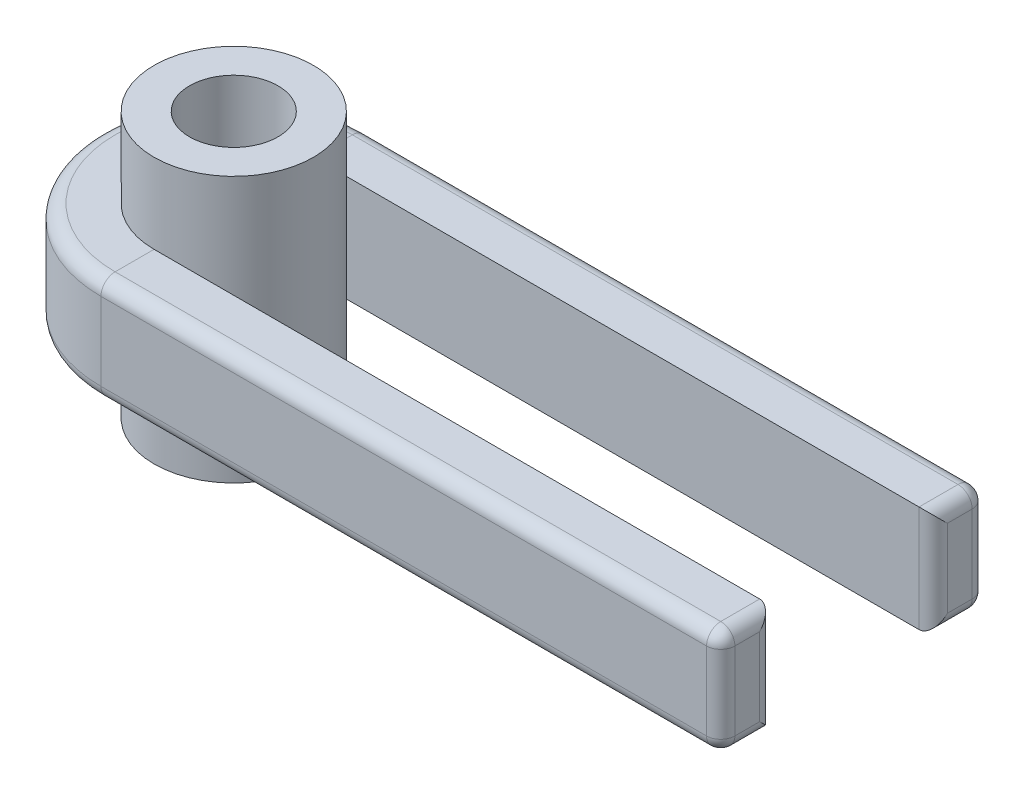
ISO-10303-21;
HEADER;
FILE_DESCRIPTION(('STEP AP214'),'2;1');
FILE_NAME('part.step','',(''),(''),'','','');
FILE_SCHEMA(('AUTOMOTIVE_DESIGN { 1 0 10303 214 1 1 1 1 }'));
ENDSEC;
DATA;
#1=APPLICATION_CONTEXT('core data for automotive mechanical design processes');
#2=APPLICATION_PROTOCOL_DEFINITION('international standard','automotive_design',2000,#1);
#3=PRODUCT_CONTEXT('',#1,'mechanical');
#4=PRODUCT('Part','Part','',(#3));
#5=PRODUCT_RELATED_PRODUCT_CATEGORY('part','',(#4));
#6=PRODUCT_DEFINITION_FORMATION('','',#4);
#7=PRODUCT_DEFINITION_CONTEXT('part definition',#1,'design');
#8=PRODUCT_DEFINITION('design','',#6,#7);
#9=PRODUCT_DEFINITION_SHAPE('','',#8);
#10=(LENGTH_UNIT() NAMED_UNIT(*) SI_UNIT(.MILLI.,.METRE.));
#11=(NAMED_UNIT(*) PLANE_ANGLE_UNIT() SI_UNIT($,.RADIAN.));
#12=(NAMED_UNIT(*) SI_UNIT($,.STERADIAN.) SOLID_ANGLE_UNIT());
#13=UNCERTAINTY_MEASURE_WITH_UNIT(LENGTH_MEASURE(1.E-05),#10,'distance_accuracy_value','');
#14=(GEOMETRIC_REPRESENTATION_CONTEXT(3) GLOBAL_UNCERTAINTY_ASSIGNED_CONTEXT((#13)) GLOBAL_UNIT_ASSIGNED_CONTEXT((#10,
#11,#12)) REPRESENTATION_CONTEXT('',''));
#15=CARTESIAN_POINT('',(0.,0.,0.));
#16=DIRECTION('',(0.,0.,1.));
#17=DIRECTION('',(1.,0.,0.));
#18=AXIS2_PLACEMENT_3D('',#15,#16,#17);
#19=CARTESIAN_POINT('',(0.,15.,0.));
#20=DIRECTION('',(0.,-1.,0.));
#21=DIRECTION('',(0.,0.,-1.));
#22=AXIS2_PLACEMENT_3D('',#19,#20,#21);
#23=CYLINDRICAL_SURFACE('',#22,4.5);
#24=CARTESIAN_POINT('',(0.,10.5,0.));
#25=DIRECTION('',(0.,-1.,0.));
#26=DIRECTION('',(0.,0.,1.));
#27=AXIS2_PLACEMENT_3D('',#24,#25,#26);
#28=CIRCLE('',#27,4.5);
#29=CARTESIAN_POINT('',(0.,10.5,4.5));
#30=VERTEX_POINT('',#29);
#31=CARTESIAN_POINT('',(0.,10.5,-4.5));
#32=VERTEX_POINT('',#31);
#33=EDGE_CURVE('E183',#30,#32,#28,.T.);
#34=ORIENTED_EDGE('',*,*,#33,.F.);
#35=DIRECTION('',(0.,-1.,0.));
#36=VECTOR('',#35,1.);
#37=CARTESIAN_POINT('',(0.,10.5,4.5));
#38=LINE('',#37,#36);
#39=CARTESIAN_POINT('',(0.,4.5,4.5));
#40=VERTEX_POINT('',#39);
#41=EDGE_CURVE('E155',#30,#40,#38,.T.);
#42=ORIENTED_EDGE('',*,*,#41,.T.);
#43=CARTESIAN_POINT('',(0.,4.5,0.));
#44=DIRECTION('',(0.,-1.,0.));
#45=DIRECTION('',(0.,0.,1.));
#46=AXIS2_PLACEMENT_3D('',#43,#44,#45);
#47=CIRCLE('',#46,4.5);
#48=CARTESIAN_POINT('',(0.,4.5,-4.5));
#49=VERTEX_POINT('',#48);
#50=EDGE_CURVE('E147',#40,#49,#47,.T.);
#51=ORIENTED_EDGE('',*,*,#50,.T.);
#52=DIRECTION('',(0.,-1.,0.));
#53=VECTOR('',#52,1.);
#54=CARTESIAN_POINT('',(0.,10.5,-4.5));
#55=LINE('',#54,#53);
#56=EDGE_CURVE('E152',#32,#49,#55,.T.);
#57=ORIENTED_EDGE('',*,*,#56,.F.);
#58=EDGE_LOOP('',(#34,#42,#51,#57));
#59=FACE_BOUND('',#58,.T.);
#60=CARTESIAN_POINT('',(0.,15.,0.));
#61=DIRECTION('',(0.,1.,0.));
#62=DIRECTION('',(0.,0.,1.));
#63=AXIS2_PLACEMENT_3D('',#60,#61,#62);
#64=CIRCLE('',#63,4.5);
#65=CARTESIAN_POINT('',(0.,15.,4.5));
#66=VERTEX_POINT('',#65);
#67=EDGE_CURVE('E209',#66,#66,#64,.T.);
#68=ORIENTED_EDGE('',*,*,#67,.F.);
#69=EDGE_LOOP('',(#68));
#70=FACE_BOUND('',#69,.T.);
#71=CARTESIAN_POINT('',(0.,0.,0.));
#72=DIRECTION('',(0.,1.,0.));
#73=DIRECTION('',(0.,0.,1.));
#74=AXIS2_PLACEMENT_3D('',#71,#72,#73);
#75=CIRCLE('',#74,4.5);
#76=CARTESIAN_POINT('',(0.,0.,4.5));
#77=VERTEX_POINT('',#76);
#78=EDGE_CURVE('E206',#77,#77,#75,.T.);
#79=ORIENTED_EDGE('',*,*,#78,.T.);
#80=EDGE_LOOP('',(#79));
#81=FACE_BOUND('',#80,.T.);
#82=ADVANCED_FACE('F33',(#59,#70,#81),#23,.T.);
#83=CARTESIAN_POINT('',(0.,15.,0.));
#84=DIRECTION('',(0.,1.,0.));
#85=DIRECTION('',(0.,0.,1.));
#86=AXIS2_PLACEMENT_3D('',#83,#84,#85);
#87=PLANE('',#86);
#88=CARTESIAN_POINT('',(0.,15.,0.));
#89=DIRECTION('',(0.,1.,0.));
#90=DIRECTION('',(0.,0.,1.));
#91=AXIS2_PLACEMENT_3D('',#88,#89,#90);
#92=CIRCLE('',#91,2.5);
#93=CARTESIAN_POINT('',(0.,15.,2.5));
#94=VERTEX_POINT('',#93);
#95=EDGE_CURVE('E172',#94,#94,#92,.T.);
#96=ORIENTED_EDGE('',*,*,#95,.F.);
#97=EDGE_LOOP('',(#96));
#98=FACE_BOUND('',#97,.T.);
#99=ORIENTED_EDGE('',*,*,#67,.T.);
#100=EDGE_LOOP('',(#99));
#101=FACE_BOUND('',#100,.T.);
#102=ADVANCED_FACE('F433',(#98,#101),#87,.T.);
#103=CARTESIAN_POINT('',(0.,0.,0.));
#104=DIRECTION('',(0.,1.,0.));
#105=DIRECTION('',(0.,0.,1.));
#106=AXIS2_PLACEMENT_3D('',#103,#104,#105);
#107=PLANE('',#106);
#108=CARTESIAN_POINT('',(0.,0.,0.));
#109=DIRECTION('',(0.,1.,0.));
#110=DIRECTION('',(0.,0.,1.));
#111=AXIS2_PLACEMENT_3D('',#108,#109,#110);
#112=CIRCLE('',#111,2.5);
#113=CARTESIAN_POINT('',(0.,0.,2.5));
#114=VERTEX_POINT('',#113);
#115=EDGE_CURVE('E203',#114,#114,#112,.T.);
#116=ORIENTED_EDGE('',*,*,#115,.T.);
#117=EDGE_LOOP('',(#116));
#118=FACE_BOUND('',#117,.T.);
#119=ORIENTED_EDGE('',*,*,#78,.F.);
#120=EDGE_LOOP('',(#119));
#121=FACE_BOUND('',#120,.T.);
#122=ADVANCED_FACE('F438',(#118,#121),#107,.F.);
#123=CARTESIAN_POINT('',(0.,0.,0.));
#124=DIRECTION('',(0.,1.,0.));
#125=DIRECTION('',(0.,0.,1.));
#126=AXIS2_PLACEMENT_3D('',#123,#124,#125);
#127=CYLINDRICAL_SURFACE('',#126,2.5);
#128=ORIENTED_EDGE('',*,*,#115,.F.);
#129=EDGE_LOOP('',(#128));
#130=FACE_BOUND('',#129,.T.);
#131=ORIENTED_EDGE('',*,*,#95,.T.);
#132=EDGE_LOOP('',(#131));
#133=FACE_BOUND('',#132,.T.);
#134=ADVANCED_FACE('F428',(#130,#133),#127,.F.);
#135=CARTESIAN_POINT('',(35.,0.,0.));
#136=DIRECTION('',(-1.,0.,0.));
#137=DIRECTION('',(0.,0.,1.));
#138=AXIS2_PLACEMENT_3D('',#135,#136,#137);
#139=PLANE('',#138);
#140=DIRECTION('',(0.,-1.,0.));
#141=VECTOR('',#140,1.);
#142=CARTESIAN_POINT('',(35.,10.5,5.3));
#143=LINE('',#142,#141);
#144=CARTESIAN_POINT('',(35.,5.3,5.3));
#145=VERTEX_POINT('',#144);
#146=CARTESIAN_POINT('',(35.,9.7,5.3));
#147=VERTEX_POINT('',#146);
#148=EDGE_CURVE('E241',#145,#147,#143,.F.);
#149=ORIENTED_EDGE('',*,*,#148,.T.);
#150=DIRECTION('',(0.,0.,-1.));
#151=VECTOR('',#150,1.);
#152=CARTESIAN_POINT('',(35.,9.7,7.5));
#153=LINE('',#152,#151);
#154=CARTESIAN_POINT('',(35.,9.7,6.7));
#155=VERTEX_POINT('',#154);
#156=EDGE_CURVE('E243',#147,#155,#153,.F.);
#157=ORIENTED_EDGE('',*,*,#156,.T.);
#158=DIRECTION('',(0.,1.,0.));
#159=VECTOR('',#158,1.);
#160=CARTESIAN_POINT('',(35.,4.5,6.7));
#161=LINE('',#160,#159);
#162=CARTESIAN_POINT('',(35.,5.3,6.7));
#163=VERTEX_POINT('',#162);
#164=EDGE_CURVE('E237',#155,#163,#161,.F.);
#165=ORIENTED_EDGE('',*,*,#164,.T.);
#166=DIRECTION('',(0.,0.,1.));
#167=VECTOR('',#166,1.);
#168=CARTESIAN_POINT('',(35.,5.3,4.5));
#169=LINE('',#168,#167);
#170=EDGE_CURVE('E239',#163,#145,#169,.F.);
#171=ORIENTED_EDGE('',*,*,#170,.T.);
#172=EDGE_LOOP('',(#149,#157,#165,#171));
#173=FACE_BOUND('',#172,.T.);
#174=ADVANCED_FACE('F411',(#173),#139,.F.);
#175=CARTESIAN_POINT('',(35.,0.,0.));
#176=DIRECTION('',(1.,0.,0.));
#177=DIRECTION('',(0.,0.,-1.));
#178=AXIS2_PLACEMENT_3D('',#175,#176,#177);
#179=PLANE('',#178);
#180=DIRECTION('',(0.,-1.,0.));
#181=VECTOR('',#180,1.);
#182=CARTESIAN_POINT('',(35.,0.,-5.3));
#183=LINE('',#182,#181);
#184=CARTESIAN_POINT('',(35.,9.7,-5.3));
#185=VERTEX_POINT('',#184);
#186=CARTESIAN_POINT('',(35.,5.3,-5.3));
#187=VERTEX_POINT('',#186);
#188=EDGE_CURVE('E252',#185,#187,#183,.T.);
#189=ORIENTED_EDGE('',*,*,#188,.T.);
#190=DIRECTION('',(0.,0.,-1.));
#191=VECTOR('',#190,1.);
#192=CARTESIAN_POINT('',(35.,5.3,0.));
#193=LINE('',#192,#191);
#194=CARTESIAN_POINT('',(35.,5.3,-6.7));
#195=VERTEX_POINT('',#194);
#196=EDGE_CURVE('E254',#187,#195,#193,.T.);
#197=ORIENTED_EDGE('',*,*,#196,.T.);
#198=DIRECTION('',(0.,1.,0.));
#199=VECTOR('',#198,1.);
#200=CARTESIAN_POINT('',(35.,0.,-6.7));
#201=LINE('',#200,#199);
#202=CARTESIAN_POINT('',(35.,9.7,-6.7));
#203=VERTEX_POINT('',#202);
#204=EDGE_CURVE('E248',#195,#203,#201,.T.);
#205=ORIENTED_EDGE('',*,*,#204,.T.);
#206=DIRECTION('',(0.,0.,1.));
#207=VECTOR('',#206,1.);
#208=CARTESIAN_POINT('',(35.,9.7,0.));
#209=LINE('',#208,#207);
#210=EDGE_CURVE('E250',#203,#185,#209,.T.);
#211=ORIENTED_EDGE('',*,*,#210,.T.);
#212=EDGE_LOOP('',(#189,#197,#205,#211));
#213=FACE_BOUND('',#212,.T.);
#214=ADVANCED_FACE('F378',(#213),#179,.T.);
#215=CARTESIAN_POINT('',(35.,10.5,4.5));
#216=DIRECTION('',(0.,0.,-1.));
#217=DIRECTION('',(0.,1.,0.));
#218=AXIS2_PLACEMENT_3D('',#215,#216,#217);
#219=PLANE('',#218);
#220=DIRECTION('',(-1.,0.,0.));
#221=VECTOR('',#220,1.);
#222=CARTESIAN_POINT('',(35.,10.5,4.5));
#223=LINE('',#222,#221);
#224=CARTESIAN_POINT('',(34.2,10.5,4.5));
#225=VERTEX_POINT('',#224);
#226=EDGE_CURVE('E188',#225,#30,#223,.T.);
#227=ORIENTED_EDGE('',*,*,#226,.F.);
#228=DIRECTION('',(0.,-1.,0.));
#229=VECTOR('',#228,1.);
#230=CARTESIAN_POINT('',(34.2,4.5,4.5));
#231=LINE('',#230,#229);
#232=CARTESIAN_POINT('',(34.2,4.5,4.5));
#233=VERTEX_POINT('',#232);
#234=EDGE_CURVE('E246',#225,#233,#231,.T.);
#235=ORIENTED_EDGE('',*,*,#234,.T.);
#236=DIRECTION('',(-1.,0.,0.));
#237=VECTOR('',#236,1.);
#238=CARTESIAN_POINT('',(35.,4.5,4.5));
#239=LINE('',#238,#237);
#240=EDGE_CURVE('E195',#233,#40,#239,.T.);
#241=ORIENTED_EDGE('',*,*,#240,.T.);
#242=ORIENTED_EDGE('',*,*,#41,.F.);
#243=EDGE_LOOP('',(#227,#235,#241,#242));
#244=FACE_BOUND('',#243,.T.);
#245=ADVANCED_FACE('F334',(#244),#219,.T.);
#246=CARTESIAN_POINT('',(35.,4.5,4.5));
#247=DIRECTION('',(0.,-1.,0.));
#248=DIRECTION('',(0.,0.,-1.));
#249=AXIS2_PLACEMENT_3D('',#246,#247,#248);
#250=PLANE('',#249);
#251=DIRECTION('',(0.,0.,1.));
#252=VECTOR('',#251,1.);
#253=CARTESIAN_POINT('',(34.2,4.5,7.5));
#254=LINE('',#253,#252);
#255=CARTESIAN_POINT('',(34.2,4.5,6.7));
#256=VERTEX_POINT('',#255);
#257=EDGE_CURVE('E212',#233,#256,#254,.T.);
#258=ORIENTED_EDGE('',*,*,#257,.T.);
#259=DIRECTION('',(-1.,0.,0.));
#260=VECTOR('',#259,1.);
#261=CARTESIAN_POINT('',(35.,4.5,6.7));
#262=LINE('',#261,#260);
#263=CARTESIAN_POINT('',(0.,4.5,6.7));
#264=VERTEX_POINT('',#263);
#265=EDGE_CURVE('E216',#256,#264,#262,.T.);
#266=ORIENTED_EDGE('',*,*,#265,.T.);
#267=DIRECTION('',(0.,0.,1.));
#268=VECTOR('',#267,1.);
#269=CARTESIAN_POINT('',(0.,4.5,4.5));
#270=LINE('',#269,#268);
#271=EDGE_CURVE('E193',#40,#264,#270,.T.);
#272=ORIENTED_EDGE('',*,*,#271,.F.);
#273=ORIENTED_EDGE('',*,*,#240,.F.);
#274=EDGE_LOOP('',(#258,#266,#272,#273));
#275=FACE_BOUND('',#274,.T.);
#276=ADVANCED_FACE('F338',(#275),#250,.T.);
#277=CARTESIAN_POINT('',(35.,10.5,7.5));
#278=DIRECTION('',(0.,0.,1.));
#279=DIRECTION('',(1.,0.,0.));
#280=AXIS2_PLACEMENT_3D('',#277,#278,#279);
#281=PLANE('',#280);
#282=DIRECTION('',(0.,1.,0.));
#283=VECTOR('',#282,1.);
#284=CARTESIAN_POINT('',(0.,10.5,7.5));
#285=LINE('',#284,#283);
#286=CARTESIAN_POINT('',(0.,5.3,7.5));
#287=VERTEX_POINT('',#286);
#288=CARTESIAN_POINT('',(0.,9.7,7.5));
#289=VERTEX_POINT('',#288);
#290=EDGE_CURVE('E194',#287,#289,#285,.T.);
#291=ORIENTED_EDGE('',*,*,#290,.F.);
#292=DIRECTION('',(-1.,0.,0.));
#293=VECTOR('',#292,1.);
#294=CARTESIAN_POINT('',(35.,5.3,7.5));
#295=LINE('',#294,#293);
#296=CARTESIAN_POINT('',(34.2,5.3,7.5));
#297=VERTEX_POINT('',#296);
#298=EDGE_CURVE('E223',#287,#297,#295,.F.);
#299=ORIENTED_EDGE('',*,*,#298,.T.);
#300=DIRECTION('',(0.,1.,0.));
#301=VECTOR('',#300,1.);
#302=CARTESIAN_POINT('',(34.2,10.5,7.5));
#303=LINE('',#302,#301);
#304=CARTESIAN_POINT('',(34.2,9.7,7.5));
#305=VERTEX_POINT('',#304);
#306=EDGE_CURVE('E219',#297,#305,#303,.T.);
#307=ORIENTED_EDGE('',*,*,#306,.T.);
#308=DIRECTION('',(-1.,0.,0.));
#309=VECTOR('',#308,1.);
#310=CARTESIAN_POINT('',(35.,9.7,7.5));
#311=LINE('',#310,#309);
#312=EDGE_CURVE('E221',#305,#289,#311,.T.);
#313=ORIENTED_EDGE('',*,*,#312,.T.);
#314=EDGE_LOOP('',(#291,#299,#307,#313));
#315=FACE_BOUND('',#314,.T.);
#316=ADVANCED_FACE('F416',(#315),#281,.T.);
#317=CARTESIAN_POINT('',(35.,10.5,4.5));
#318=DIRECTION('',(0.,1.,0.));
#319=DIRECTION('',(0.,0.,1.));
#320=AXIS2_PLACEMENT_3D('',#317,#318,#319);
#321=PLANE('',#320);
#322=DIRECTION('',(0.,0.,-1.));
#323=VECTOR('',#322,1.);
#324=CARTESIAN_POINT('',(0.,10.5,4.5));
#325=LINE('',#324,#323);
#326=CARTESIAN_POINT('',(0.,10.5,6.7));
#327=VERTEX_POINT('',#326);
#328=EDGE_CURVE('E185',#327,#30,#325,.T.);
#329=ORIENTED_EDGE('',*,*,#328,.F.);
#330=DIRECTION('',(-1.,0.,0.));
#331=VECTOR('',#330,1.);
#332=CARTESIAN_POINT('',(35.,10.5,6.7));
#333=LINE('',#332,#331);
#334=CARTESIAN_POINT('',(34.2,10.5,6.7));
#335=VERTEX_POINT('',#334);
#336=EDGE_CURVE('E233',#327,#335,#333,.F.);
#337=ORIENTED_EDGE('',*,*,#336,.T.);
#338=DIRECTION('',(0.,0.,-1.));
#339=VECTOR('',#338,1.);
#340=CARTESIAN_POINT('',(34.2,10.5,4.5));
#341=LINE('',#340,#339);
#342=EDGE_CURVE('E231',#335,#225,#341,.T.);
#343=ORIENTED_EDGE('',*,*,#342,.T.);
#344=ORIENTED_EDGE('',*,*,#226,.T.);
#345=EDGE_LOOP('',(#329,#337,#343,#344));
#346=FACE_BOUND('',#345,.T.);
#347=ADVANCED_FACE('F394',(#346),#321,.T.);
#348=CARTESIAN_POINT('',(0.,4.5,4.5));
#349=DIRECTION('',(0.,-1.,0.));
#350=DIRECTION('',(0.,0.,-1.));
#351=AXIS2_PLACEMENT_3D('',#348,#349,#350);
#352=PLANE('',#351);
#353=ORIENTED_EDGE('',*,*,#271,.T.);
#354=CARTESIAN_POINT('',(0.,4.5,0.));
#355=DIRECTION('',(0.,-1.,0.));
#356=DIRECTION('',(0.,0.,-1.));
#357=AXIS2_PLACEMENT_3D('',#354,#355,#356);
#358=CIRCLE('',#357,6.7);
#359=CARTESIAN_POINT('',(0.,4.5,-6.7));
#360=VERTEX_POINT('',#359);
#361=EDGE_CURVE('E177',#264,#360,#358,.T.);
#362=ORIENTED_EDGE('',*,*,#361,.T.);
#363=DIRECTION('',(0.,0.,-1.));
#364=VECTOR('',#363,1.);
#365=CARTESIAN_POINT('',(0.,4.5,-4.5));
#366=LINE('',#365,#364);
#367=EDGE_CURVE('E160',#49,#360,#366,.T.);
#368=ORIENTED_EDGE('',*,*,#367,.F.);
#369=ORIENTED_EDGE('',*,*,#50,.F.);
#370=EDGE_LOOP('',(#353,#362,#368,#369));
#371=FACE_BOUND('',#370,.T.);
#372=ADVANCED_FACE('F175',(#371),#352,.T.);
#373=CARTESIAN_POINT('',(0.,7.5,0.));
#374=DIRECTION('',(0.,-1.,0.));
#375=DIRECTION('',(0.,0.,-1.));
#376=AXIS2_PLACEMENT_3D('',#373,#374,#375);
#377=CYLINDRICAL_SURFACE('',#376,7.5);
#378=DIRECTION('',(0.,1.,0.));
#379=VECTOR('',#378,1.);
#380=CARTESIAN_POINT('',(0.,10.5,-7.5));
#381=LINE('',#380,#379);
#382=CARTESIAN_POINT('',(0.,5.3,-7.5));
#383=VERTEX_POINT('',#382);
#384=CARTESIAN_POINT('',(0.,9.7,-7.5));
#385=VERTEX_POINT('',#384);
#386=EDGE_CURVE('E178',#383,#385,#381,.T.);
#387=ORIENTED_EDGE('',*,*,#386,.F.);
#388=CARTESIAN_POINT('',(0.,5.3,0.));
#389=DIRECTION('',(0.,-1.,0.));
#390=DIRECTION('',(0.,0.,-1.));
#391=AXIS2_PLACEMENT_3D('',#388,#389,#390);
#392=CIRCLE('',#391,7.5);
#393=EDGE_CURVE('E229',#383,#287,#392,.F.);
#394=ORIENTED_EDGE('',*,*,#393,.T.);
#395=ORIENTED_EDGE('',*,*,#290,.T.);
#396=CARTESIAN_POINT('',(0.,9.7,0.));
#397=DIRECTION('',(0.,1.,0.));
#398=DIRECTION('',(0.,0.,1.));
#399=AXIS2_PLACEMENT_3D('',#396,#397,#398);
#400=CIRCLE('',#399,7.5);
#401=EDGE_CURVE('E227',#289,#385,#400,.F.);
#402=ORIENTED_EDGE('',*,*,#401,.T.);
#403=EDGE_LOOP('',(#387,#394,#395,#402));
#404=FACE_BOUND('',#403,.T.);
#405=ADVANCED_FACE('F419',(#404),#377,.T.);
#406=CARTESIAN_POINT('',(0.,10.5,4.5));
#407=DIRECTION('',(0.,1.,0.));
#408=DIRECTION('',(0.,0.,1.));
#409=AXIS2_PLACEMENT_3D('',#406,#407,#408);
#410=PLANE('',#409);
#411=DIRECTION('',(0.,0.,1.));
#412=VECTOR('',#411,1.);
#413=CARTESIAN_POINT('',(0.,10.5,-4.5));
#414=LINE('',#413,#412);
#415=CARTESIAN_POINT('',(0.,10.5,-6.7));
#416=VERTEX_POINT('',#415);
#417=EDGE_CURVE('E192',#416,#32,#414,.T.);
#418=ORIENTED_EDGE('',*,*,#417,.F.);
#419=CARTESIAN_POINT('',(0.,10.5,0.));
#420=DIRECTION('',(0.,1.,0.));
#421=DIRECTION('',(0.,0.,1.));
#422=AXIS2_PLACEMENT_3D('',#419,#420,#421);
#423=CIRCLE('',#422,6.7);
#424=EDGE_CURVE('E235',#416,#327,#423,.T.);
#425=ORIENTED_EDGE('',*,*,#424,.T.);
#426=ORIENTED_EDGE('',*,*,#328,.T.);
#427=ORIENTED_EDGE('',*,*,#33,.T.);
#428=EDGE_LOOP('',(#418,#425,#426,#427));
#429=FACE_BOUND('',#428,.T.);
#430=ADVANCED_FACE('F392',(#429),#410,.T.);
#431=CARTESIAN_POINT('',(0.,10.5,-4.5));
#432=DIRECTION('',(0.,0.,1.));
#433=DIRECTION('',(0.,-1.,0.));
#434=AXIS2_PLACEMENT_3D('',#431,#432,#433);
#435=PLANE('',#434);
#436=DIRECTION('',(1.,0.,0.));
#437=VECTOR('',#436,1.);
#438=CARTESIAN_POINT('',(0.,4.5,-4.5));
#439=LINE('',#438,#437);
#440=CARTESIAN_POINT('',(34.2,4.5,-4.5));
#441=VERTEX_POINT('',#440);
#442=EDGE_CURVE('E165',#49,#441,#439,.T.);
#443=ORIENTED_EDGE('',*,*,#442,.T.);
#444=DIRECTION('',(0.,-1.,0.));
#445=VECTOR('',#444,1.);
#446=CARTESIAN_POINT('',(34.2,10.5,-4.5));
#447=LINE('',#446,#445);
#448=CARTESIAN_POINT('',(34.2,10.5,-4.5));
#449=VERTEX_POINT('',#448);
#450=EDGE_CURVE('E260',#441,#449,#447,.F.);
#451=ORIENTED_EDGE('',*,*,#450,.T.);
#452=DIRECTION('',(1.,0.,0.));
#453=VECTOR('',#452,1.);
#454=CARTESIAN_POINT('',(0.,10.5,-4.5));
#455=LINE('',#454,#453);
#456=EDGE_CURVE('E173',#32,#449,#455,.T.);
#457=ORIENTED_EDGE('',*,*,#456,.F.);
#458=ORIENTED_EDGE('',*,*,#56,.T.);
#459=EDGE_LOOP('',(#443,#451,#457,#458));
#460=FACE_BOUND('',#459,.T.);
#461=ADVANCED_FACE('F180',(#460),#435,.T.);
#462=CARTESIAN_POINT('',(0.,4.5,-4.5));
#463=DIRECTION('',(0.,-1.,0.));
#464=DIRECTION('',(0.,0.,-1.));
#465=AXIS2_PLACEMENT_3D('',#462,#463,#464);
#466=PLANE('',#465);
#467=DIRECTION('',(1.,0.,0.));
#468=VECTOR('',#467,1.);
#469=CARTESIAN_POINT('',(0.,4.5,-6.7));
#470=LINE('',#469,#468);
#471=CARTESIAN_POINT('',(34.2,4.5,-6.7));
#472=VERTEX_POINT('',#471);
#473=EDGE_CURVE('E257',#360,#472,#470,.T.);
#474=ORIENTED_EDGE('',*,*,#473,.T.);
#475=DIRECTION('',(0.,0.,-1.));
#476=VECTOR('',#475,1.);
#477=CARTESIAN_POINT('',(34.2,4.5,-4.5));
#478=LINE('',#477,#476);
#479=EDGE_CURVE('E169',#472,#441,#478,.F.);
#480=ORIENTED_EDGE('',*,*,#479,.T.);
#481=ORIENTED_EDGE('',*,*,#442,.F.);
#482=ORIENTED_EDGE('',*,*,#367,.T.);
#483=EDGE_LOOP('',(#474,#480,#481,#482));
#484=FACE_BOUND('',#483,.T.);
#485=ADVANCED_FACE('F166',(#484),#466,.T.);
#486=CARTESIAN_POINT('',(0.,10.5,-7.5));
#487=DIRECTION('',(0.,0.,-1.));
#488=DIRECTION('',(-1.,0.,0.));
#489=AXIS2_PLACEMENT_3D('',#486,#487,#488);
#490=PLANE('',#489);
#491=DIRECTION('',(0.,1.,0.));
#492=VECTOR('',#491,1.);
#493=CARTESIAN_POINT('',(34.2,10.5,-7.5));
#494=LINE('',#493,#492);
#495=CARTESIAN_POINT('',(34.2,9.7,-7.5));
#496=VERTEX_POINT('',#495);
#497=CARTESIAN_POINT('',(34.2,5.3,-7.5));
#498=VERTEX_POINT('',#497);
#499=EDGE_CURVE('E42',#496,#498,#494,.F.);
#500=ORIENTED_EDGE('',*,*,#499,.T.);
#501=DIRECTION('',(1.,0.,0.));
#502=VECTOR('',#501,1.);
#503=CARTESIAN_POINT('',(0.,5.3,-7.5));
#504=LINE('',#503,#502);
#505=EDGE_CURVE('E11',#498,#383,#504,.F.);
#506=ORIENTED_EDGE('',*,*,#505,.T.);
#507=ORIENTED_EDGE('',*,*,#386,.T.);
#508=DIRECTION('',(1.,0.,0.));
#509=VECTOR('',#508,1.);
#510=CARTESIAN_POINT('',(0.,9.7,-7.5));
#511=LINE('',#510,#509);
#512=EDGE_CURVE('E53',#385,#496,#511,.T.);
#513=ORIENTED_EDGE('',*,*,#512,.T.);
#514=EDGE_LOOP('',(#500,#506,#507,#513));
#515=FACE_BOUND('',#514,.T.);
#516=ADVANCED_FACE('F420',(#515),#490,.T.);
#517=CARTESIAN_POINT('',(0.,10.5,-4.5));
#518=DIRECTION('',(0.,1.,0.));
#519=DIRECTION('',(0.,0.,1.));
#520=AXIS2_PLACEMENT_3D('',#517,#518,#519);
#521=PLANE('',#520);
#522=ORIENTED_EDGE('',*,*,#456,.T.);
#523=DIRECTION('',(0.,0.,1.));
#524=VECTOR('',#523,1.);
#525=CARTESIAN_POINT('',(34.2,10.5,-4.5));
#526=LINE('',#525,#524);
#527=CARTESIAN_POINT('',(34.2,10.5,-6.7));
#528=VERTEX_POINT('',#527);
#529=EDGE_CURVE('E264',#449,#528,#526,.F.);
#530=ORIENTED_EDGE('',*,*,#529,.T.);
#531=DIRECTION('',(1.,0.,0.));
#532=VECTOR('',#531,1.);
#533=CARTESIAN_POINT('',(0.,10.5,-6.7));
#534=LINE('',#533,#532);
#535=EDGE_CURVE('E262',#528,#416,#534,.F.);
#536=ORIENTED_EDGE('',*,*,#535,.T.);
#537=ORIENTED_EDGE('',*,*,#417,.T.);
#538=EDGE_LOOP('',(#522,#530,#536,#537));
#539=FACE_BOUND('',#538,.T.);
#540=ADVANCED_FACE('F382',(#539),#521,.T.);
#541=CARTESIAN_POINT('',(34.2,9.7,0.));
#542=DIRECTION('',(0.,0.,1.));
#543=DIRECTION('',(1.,0.,0.));
#544=AXIS2_PLACEMENT_3D('',#541,#542,#543);
#545=CYLINDRICAL_SURFACE('',#544,0.8);
#546=CARTESIAN_POINT('',(34.2,9.7,-6.7));
#547=DIRECTION('',(0.,0.,-1.));
#548=DIRECTION('',(-1.,0.,0.));
#549=AXIS2_PLACEMENT_3D('',#546,#547,#548);
#550=CIRCLE('',#549,0.8);
#551=EDGE_CURVE('E316',#528,#203,#550,.T.);
#552=ORIENTED_EDGE('',*,*,#551,.F.);
#553=ORIENTED_EDGE('',*,*,#529,.F.);
#554=CARTESIAN_POINT('',(34.2,9.7,-5.3));
#555=DIRECTION('',(0.,-0.707106781186548,0.707106781186547));
#556=DIRECTION('',(0.,0.707106781186547,0.707106781186548));
#557=AXIS2_PLACEMENT_3D('',#554,#555,#556);
#558=ELLIPSE('',#557,1.13137084989848,0.8);
#559=EDGE_CURVE('E318',#185,#449,#558,.T.);
#560=ORIENTED_EDGE('',*,*,#559,.F.);
#561=ORIENTED_EDGE('',*,*,#210,.F.);
#562=EDGE_LOOP('',(#552,#553,#560,#561));
#563=FACE_BOUND('',#562,.T.);
#564=ADVANCED_FACE('F35',(#563),#545,.T.);
#565=CARTESIAN_POINT('',(0.,9.7,-6.7));
#566=DIRECTION('',(1.,0.,0.));
#567=DIRECTION('',(0.,0.,-1.));
#568=AXIS2_PLACEMENT_3D('',#565,#566,#567);
#569=CYLINDRICAL_SURFACE('',#568,0.8);
#570=CARTESIAN_POINT('',(34.2,9.7,-6.7));
#571=DIRECTION('',(1.,0.,0.));
#572=DIRECTION('',(0.,0.,-1.));
#573=AXIS2_PLACEMENT_3D('',#570,#571,#572);
#574=CIRCLE('',#573,0.8);
#575=EDGE_CURVE('E313',#496,#528,#574,.T.);
#576=ORIENTED_EDGE('',*,*,#575,.F.);
#577=ORIENTED_EDGE('',*,*,#512,.F.);
#578=CARTESIAN_POINT('',(0.,9.7,-6.7));
#579=DIRECTION('',(-1.,0.,0.));
#580=DIRECTION('',(0.,0.,1.));
#581=AXIS2_PLACEMENT_3D('',#578,#579,#580);
#582=CIRCLE('',#581,0.8);
#583=EDGE_CURVE('E37',#416,#385,#582,.T.);
#584=ORIENTED_EDGE('',*,*,#583,.F.);
#585=ORIENTED_EDGE('',*,*,#535,.F.);
#586=EDGE_LOOP('',(#576,#577,#584,#585));
#587=FACE_BOUND('',#586,.T.);
#588=ADVANCED_FACE('F390',(#587),#569,.T.);
#589=CARTESIAN_POINT('',(0.,9.7,0.));
#590=DIRECTION('',(0.,1.,0.));
#591=DIRECTION('',(0.,0.,1.));
#592=AXIS2_PLACEMENT_3D('',#589,#590,#591);
#593=TOROIDAL_SURFACE('',#592,6.7,0.8);
#594=ORIENTED_EDGE('',*,*,#583,.T.);
#595=ORIENTED_EDGE('',*,*,#401,.F.);
#596=CARTESIAN_POINT('',(0.,9.7,6.7));
#597=DIRECTION('',(1.,0.,0.));
#598=DIRECTION('',(0.,0.,-1.));
#599=AXIS2_PLACEMENT_3D('',#596,#597,#598);
#600=CIRCLE('',#599,0.8);
#601=EDGE_CURVE('E310',#327,#289,#600,.T.);
#602=ORIENTED_EDGE('',*,*,#601,.F.);
#603=ORIENTED_EDGE('',*,*,#424,.F.);
#604=EDGE_LOOP('',(#594,#595,#602,#603));
#605=FACE_BOUND('',#604,.T.);
#606=ADVANCED_FACE('F397',(#605),#593,.T.);
#607=CARTESIAN_POINT('',(34.2,0.,-5.3));
#608=DIRECTION('',(0.,-1.,0.));
#609=DIRECTION('',(0.,0.,-1.));
#610=AXIS2_PLACEMENT_3D('',#607,#608,#609);
#611=CYLINDRICAL_SURFACE('',#610,0.8);
#612=ORIENTED_EDGE('',*,*,#559,.T.);
#613=ORIENTED_EDGE('',*,*,#450,.F.);
#614=CARTESIAN_POINT('',(34.2,5.3,-5.3));
#615=DIRECTION('',(0.,-0.707106781186547,-0.707106781186548));
#616=DIRECTION('',(0.,-0.707106781186548,0.707106781186547));
#617=AXIS2_PLACEMENT_3D('',#614,#615,#616);
#618=ELLIPSE('',#617,1.13137084989848,0.8);
#619=EDGE_CURVE('E307',#187,#441,#618,.T.);
#620=ORIENTED_EDGE('',*,*,#619,.F.);
#621=ORIENTED_EDGE('',*,*,#188,.F.);
#622=EDGE_LOOP('',(#612,#613,#620,#621));
#623=FACE_BOUND('',#622,.T.);
#624=ADVANCED_FACE('F379',(#623),#611,.T.);
#625=CARTESIAN_POINT('',(34.2,9.7,-6.7));
#626=DIRECTION('',(0.,1.,0.));
#627=DIRECTION('',(0.,0.,1.));
#628=AXIS2_PLACEMENT_3D('',#625,#626,#627);
#629=SPHERICAL_SURFACE('',#628,0.8);
#630=ORIENTED_EDGE('',*,*,#575,.T.);
#631=ORIENTED_EDGE('',*,*,#551,.T.);
#632=CARTESIAN_POINT('',(34.2,9.7,-6.7));
#633=DIRECTION('',(0.,1.,0.));
#634=DIRECTION('',(0.,0.,1.));
#635=AXIS2_PLACEMENT_3D('',#632,#633,#634);
#636=CIRCLE('',#635,0.8);
#637=EDGE_CURVE('E304',#496,#203,#636,.F.);
#638=ORIENTED_EDGE('',*,*,#637,.F.);
#639=EDGE_LOOP('',(#630,#631,#638));
#640=FACE_BOUND('',#639,.T.);
#641=ADVANCED_FACE('F388',(#640),#629,.T.);
#642=CARTESIAN_POINT('',(35.,9.7,6.7));
#643=DIRECTION('',(-1.,0.,0.));
#644=DIRECTION('',(0.,0.,1.));
#645=AXIS2_PLACEMENT_3D('',#642,#643,#644);
#646=CYLINDRICAL_SURFACE('',#645,0.8);
#647=ORIENTED_EDGE('',*,*,#601,.T.);
#648=ORIENTED_EDGE('',*,*,#312,.F.);
#649=CARTESIAN_POINT('',(34.2,9.7,6.7));
#650=DIRECTION('',(1.,0.,0.));
#651=DIRECTION('',(0.,0.,-1.));
#652=AXIS2_PLACEMENT_3D('',#649,#650,#651);
#653=CIRCLE('',#652,0.8);
#654=EDGE_CURVE('E301',#335,#305,#653,.T.);
#655=ORIENTED_EDGE('',*,*,#654,.F.);
#656=ORIENTED_EDGE('',*,*,#336,.F.);
#657=EDGE_LOOP('',(#647,#648,#655,#656));
#658=FACE_BOUND('',#657,.T.);
#659=ADVANCED_FACE('F401',(#658),#646,.T.);
#660=CARTESIAN_POINT('',(34.2,9.7,4.5));
#661=DIRECTION('',(0.,0.,1.));
#662=DIRECTION('',(1.,0.,0.));
#663=AXIS2_PLACEMENT_3D('',#660,#661,#662);
#664=CYLINDRICAL_SURFACE('',#663,0.8);
#665=CARTESIAN_POINT('',(34.2,9.7,5.3));
#666=DIRECTION('',(0.,0.707106781186548,0.707106781186547));
#667=DIRECTION('',(0.,0.707106781186547,-0.707106781186548));
#668=AXIS2_PLACEMENT_3D('',#665,#666,#667);
#669=ELLIPSE('',#668,1.13137084989848,0.8);
#670=EDGE_CURVE('E295',#225,#147,#669,.F.);
#671=ORIENTED_EDGE('',*,*,#670,.F.);
#672=ORIENTED_EDGE('',*,*,#342,.F.);
#673=CARTESIAN_POINT('',(34.2,9.7,6.7));
#674=DIRECTION('',(0.,0.,1.));
#675=DIRECTION('',(1.,0.,0.));
#676=AXIS2_PLACEMENT_3D('',#673,#674,#675);
#677=CIRCLE('',#676,0.8);
#678=EDGE_CURVE('E298',#155,#335,#677,.T.);
#679=ORIENTED_EDGE('',*,*,#678,.F.);
#680=ORIENTED_EDGE('',*,*,#156,.F.);
#681=EDGE_LOOP('',(#671,#672,#679,#680));
#682=FACE_BOUND('',#681,.T.);
#683=ADVANCED_FACE('F409',(#682),#664,.T.);
#684=CARTESIAN_POINT('',(34.2,5.3,0.));
#685=DIRECTION('',(0.,0.,-1.));
#686=DIRECTION('',(-1.,0.,0.));
#687=AXIS2_PLACEMENT_3D('',#684,#685,#686);
#688=CYLINDRICAL_SURFACE('',#687,0.8);
#689=ORIENTED_EDGE('',*,*,#619,.T.);
#690=ORIENTED_EDGE('',*,*,#479,.F.);
#691=CARTESIAN_POINT('',(34.2,5.3,-6.7));
#692=DIRECTION('',(0.,0.,-1.));
#693=DIRECTION('',(-1.,0.,0.));
#694=AXIS2_PLACEMENT_3D('',#691,#692,#693);
#695=CIRCLE('',#694,0.8);
#696=EDGE_CURVE('E292',#195,#472,#695,.T.);
#697=ORIENTED_EDGE('',*,*,#696,.F.);
#698=ORIENTED_EDGE('',*,*,#196,.F.);
#699=EDGE_LOOP('',(#689,#690,#697,#698));
#700=FACE_BOUND('',#699,.T.);
#701=ADVANCED_FACE('F367',(#700),#688,.T.);
#702=CARTESIAN_POINT('',(34.2,0.,-6.7));
#703=DIRECTION('',(0.,1.,0.));
#704=DIRECTION('',(0.,0.,1.));
#705=AXIS2_PLACEMENT_3D('',#702,#703,#704);
#706=CYLINDRICAL_SURFACE('',#705,0.8);
#707=ORIENTED_EDGE('',*,*,#637,.T.);
#708=ORIENTED_EDGE('',*,*,#204,.F.);
#709=CARTESIAN_POINT('',(34.2,5.3,-6.7));
#710=DIRECTION('',(0.,-1.,0.));
#711=DIRECTION('',(0.,0.,-1.));
#712=AXIS2_PLACEMENT_3D('',#709,#710,#711);
#713=CIRCLE('',#712,0.8);
#714=EDGE_CURVE('E290',#498,#195,#713,.T.);
#715=ORIENTED_EDGE('',*,*,#714,.F.);
#716=ORIENTED_EDGE('',*,*,#499,.F.);
#717=EDGE_LOOP('',(#707,#708,#715,#716));
#718=FACE_BOUND('',#717,.T.);
#719=ADVANCED_FACE('F374',(#718),#706,.T.);
#720=CARTESIAN_POINT('',(34.2,9.7,6.7));
#721=DIRECTION('',(0.,1.,0.));
#722=DIRECTION('',(0.,0.,1.));
#723=AXIS2_PLACEMENT_3D('',#720,#721,#722);
#724=SPHERICAL_SURFACE('',#723,0.8);
#725=ORIENTED_EDGE('',*,*,#678,.T.);
#726=ORIENTED_EDGE('',*,*,#654,.T.);
#727=CARTESIAN_POINT('',(34.2,9.7,6.7));
#728=DIRECTION('',(0.,1.,0.));
#729=DIRECTION('',(0.,0.,1.));
#730=AXIS2_PLACEMENT_3D('',#727,#728,#729);
#731=CIRCLE('',#730,0.8);
#732=EDGE_CURVE('E287',#155,#305,#731,.F.);
#733=ORIENTED_EDGE('',*,*,#732,.F.);
#734=EDGE_LOOP('',(#725,#726,#733));
#735=FACE_BOUND('',#734,.T.);
#736=ADVANCED_FACE('F405',(#735),#724,.T.);
#737=CARTESIAN_POINT('',(34.2,10.5,5.3));
#738=DIRECTION('',(0.,1.,0.));
#739=DIRECTION('',(0.,0.,1.));
#740=AXIS2_PLACEMENT_3D('',#737,#738,#739);
#741=CYLINDRICAL_SURFACE('',#740,0.8);
#742=ORIENTED_EDGE('',*,*,#670,.T.);
#743=ORIENTED_EDGE('',*,*,#148,.F.);
#744=CARTESIAN_POINT('',(34.2,5.3,5.3));
#745=DIRECTION('',(0.,0.707106781186547,-0.707106781186548));
#746=DIRECTION('',(0.,-0.707106781186548,-0.707106781186547));
#747=AXIS2_PLACEMENT_3D('',#744,#745,#746);
#748=ELLIPSE('',#747,1.13137084989848,0.8);
#749=EDGE_CURVE('E284',#233,#145,#748,.F.);
#750=ORIENTED_EDGE('',*,*,#749,.F.);
#751=ORIENTED_EDGE('',*,*,#234,.F.);
#752=EDGE_LOOP('',(#742,#743,#750,#751));
#753=FACE_BOUND('',#752,.T.);
#754=ADVANCED_FACE('F343',(#753),#741,.T.);
#755=CARTESIAN_POINT('',(34.2,5.3,-6.7));
#756=DIRECTION('',(1.,0.,0.));
#757=DIRECTION('',(0.,0.,-1.));
#758=AXIS2_PLACEMENT_3D('',#755,#756,#757);
#759=SPHERICAL_SURFACE('',#758,0.8);
#760=ORIENTED_EDGE('',*,*,#714,.T.);
#761=ORIENTED_EDGE('',*,*,#696,.T.);
#762=CARTESIAN_POINT('',(34.2,5.3,-6.7));
#763=DIRECTION('',(1.,0.,0.));
#764=DIRECTION('',(0.,0.,-1.));
#765=AXIS2_PLACEMENT_3D('',#762,#763,#764);
#766=CIRCLE('',#765,0.8);
#767=EDGE_CURVE('E281',#498,#472,#766,.F.);
#768=ORIENTED_EDGE('',*,*,#767,.F.);
#769=EDGE_LOOP('',(#760,#761,#768));
#770=FACE_BOUND('',#769,.T.);
#771=ADVANCED_FACE('F372',(#770),#759,.T.);
#772=CARTESIAN_POINT('',(34.2,10.5,6.7));
#773=DIRECTION('',(0.,-1.,0.));
#774=DIRECTION('',(0.,0.,-1.));
#775=AXIS2_PLACEMENT_3D('',#772,#773,#774);
#776=CYLINDRICAL_SURFACE('',#775,0.8);
#777=ORIENTED_EDGE('',*,*,#732,.T.);
#778=ORIENTED_EDGE('',*,*,#306,.F.);
#779=CARTESIAN_POINT('',(34.2,5.3,6.7));
#780=DIRECTION('',(0.,-1.,0.));
#781=DIRECTION('',(0.,0.,-1.));
#782=AXIS2_PLACEMENT_3D('',#779,#780,#781);
#783=CIRCLE('',#782,0.8);
#784=EDGE_CURVE('E278',#163,#297,#783,.T.);
#785=ORIENTED_EDGE('',*,*,#784,.F.);
#786=ORIENTED_EDGE('',*,*,#164,.F.);
#787=EDGE_LOOP('',(#777,#778,#785,#786));
#788=FACE_BOUND('',#787,.T.);
#789=ADVANCED_FACE('F413',(#788),#776,.T.);
#790=CARTESIAN_POINT('',(34.2,5.3,4.5));
#791=DIRECTION('',(0.,0.,-1.));
#792=DIRECTION('',(-1.,0.,0.));
#793=AXIS2_PLACEMENT_3D('',#790,#791,#792);
#794=CYLINDRICAL_SURFACE('',#793,0.8);
#795=ORIENTED_EDGE('',*,*,#749,.T.);
#796=ORIENTED_EDGE('',*,*,#170,.F.);
#797=CARTESIAN_POINT('',(34.2,5.3,6.7));
#798=DIRECTION('',(0.,0.,1.));
#799=DIRECTION('',(1.,0.,0.));
#800=AXIS2_PLACEMENT_3D('',#797,#798,#799);
#801=CIRCLE('',#800,0.8);
#802=EDGE_CURVE('E275',#256,#163,#801,.T.);
#803=ORIENTED_EDGE('',*,*,#802,.F.);
#804=ORIENTED_EDGE('',*,*,#257,.F.);
#805=EDGE_LOOP('',(#795,#796,#803,#804));
#806=FACE_BOUND('',#805,.T.);
#807=ADVANCED_FACE('F346',(#806),#794,.T.);
#808=CARTESIAN_POINT('',(0.,5.3,-6.7));
#809=DIRECTION('',(1.,0.,0.));
#810=DIRECTION('',(0.,0.,-1.));
#811=AXIS2_PLACEMENT_3D('',#808,#809,#810);
#812=CYLINDRICAL_SURFACE('',#811,0.8);
#813=ORIENTED_EDGE('',*,*,#767,.T.);
#814=ORIENTED_EDGE('',*,*,#473,.F.);
#815=CARTESIAN_POINT('',(0.,5.3,-6.7));
#816=DIRECTION('',(-1.,0.,0.));
#817=DIRECTION('',(0.,0.,1.));
#818=AXIS2_PLACEMENT_3D('',#815,#816,#817);
#819=CIRCLE('',#818,0.8);
#820=EDGE_CURVE('E272',#383,#360,#819,.T.);
#821=ORIENTED_EDGE('',*,*,#820,.F.);
#822=ORIENTED_EDGE('',*,*,#505,.F.);
#823=EDGE_LOOP('',(#813,#814,#821,#822));
#824=FACE_BOUND('',#823,.T.);
#825=ADVANCED_FACE('F363',(#824),#812,.T.);
#826=CARTESIAN_POINT('',(34.2,5.3,6.7));
#827=DIRECTION('',(1.,0.,0.));
#828=DIRECTION('',(0.,0.,-1.));
#829=AXIS2_PLACEMENT_3D('',#826,#827,#828);
#830=SPHERICAL_SURFACE('',#829,0.8);
#831=ORIENTED_EDGE('',*,*,#802,.T.);
#832=ORIENTED_EDGE('',*,*,#784,.T.);
#833=CARTESIAN_POINT('',(34.2,5.3,6.7));
#834=DIRECTION('',(1.,0.,0.));
#835=DIRECTION('',(0.,0.,-1.));
#836=AXIS2_PLACEMENT_3D('',#833,#834,#835);
#837=CIRCLE('',#836,0.8);
#838=EDGE_CURVE('E270',#256,#297,#837,.F.);
#839=ORIENTED_EDGE('',*,*,#838,.F.);
#840=EDGE_LOOP('',(#831,#832,#839));
#841=FACE_BOUND('',#840,.T.);
#842=ADVANCED_FACE('F351',(#841),#830,.T.);
#843=CARTESIAN_POINT('',(0.,5.3,0.));
#844=DIRECTION('',(0.,-1.,0.));
#845=DIRECTION('',(0.,0.,-1.));
#846=AXIS2_PLACEMENT_3D('',#843,#844,#845);
#847=TOROIDAL_SURFACE('',#846,6.7,0.8);
#848=ORIENTED_EDGE('',*,*,#820,.T.);
#849=ORIENTED_EDGE('',*,*,#361,.F.);
#850=CARTESIAN_POINT('',(0.,5.3,6.7));
#851=DIRECTION('',(1.,0.,0.));
#852=DIRECTION('',(0.,0.,-1.));
#853=AXIS2_PLACEMENT_3D('',#850,#851,#852);
#854=CIRCLE('',#853,0.8);
#855=EDGE_CURVE('E268',#287,#264,#854,.T.);
#856=ORIENTED_EDGE('',*,*,#855,.F.);
#857=ORIENTED_EDGE('',*,*,#393,.F.);
#858=EDGE_LOOP('',(#848,#849,#856,#857));
#859=FACE_BOUND('',#858,.T.);
#860=ADVANCED_FACE('F359',(#859),#847,.T.);
#861=CARTESIAN_POINT('',(35.,5.3,6.7));
#862=DIRECTION('',(-1.,0.,0.));
#863=DIRECTION('',(0.,0.,1.));
#864=AXIS2_PLACEMENT_3D('',#861,#862,#863);
#865=CYLINDRICAL_SURFACE('',#864,0.8);
#866=ORIENTED_EDGE('',*,*,#838,.T.);
#867=ORIENTED_EDGE('',*,*,#298,.F.);
#868=ORIENTED_EDGE('',*,*,#855,.T.);
#869=ORIENTED_EDGE('',*,*,#265,.F.);
#870=EDGE_LOOP('',(#866,#867,#868,#869));
#871=FACE_BOUND('',#870,.T.);
#872=ADVANCED_FACE('F355',(#871),#865,.T.);
#873=CLOSED_SHELL('',(#82,#102,#122,#134,#174,#214,#245,#276,#316,#347,#372,#405,#430,#461,#485,
#516,#540,#564,#588,#606,#624,#641,#659,#683,#701,#719,#736,#754,#771,#789,#807,#825,#842,#860,#872));
#874=MANIFOLD_SOLID_BREP('B2',#873);
#875=ADVANCED_BREP_SHAPE_REPRESENTATION('',(#18,#874),#14);
#876=SHAPE_DEFINITION_REPRESENTATION(#9,#875);
ENDSEC;
END-ISO-10303-21;
